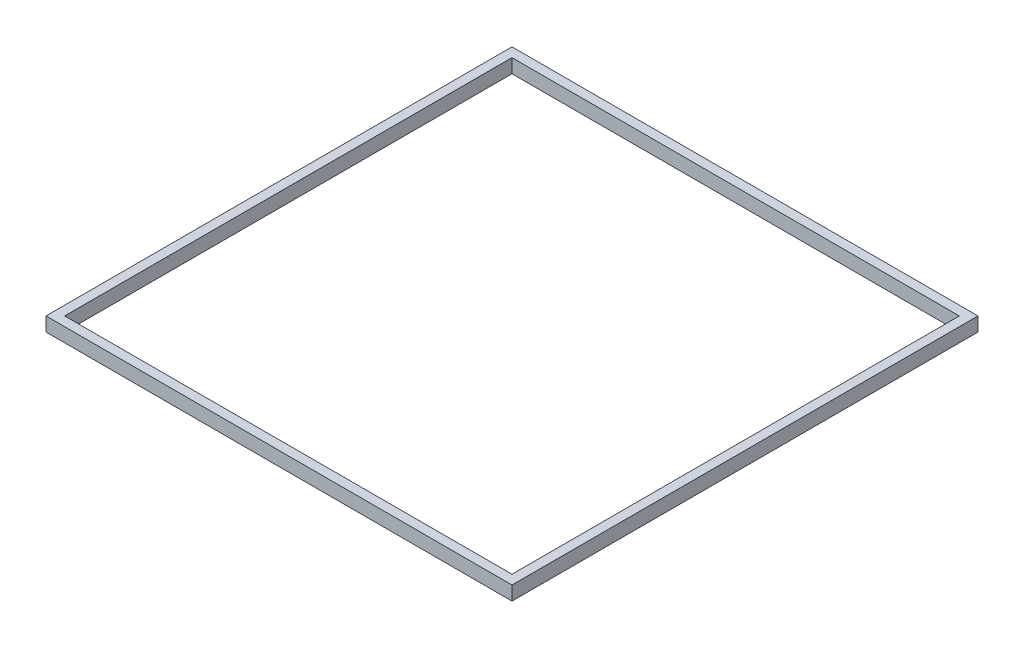
ISO-10303-21;
HEADER;
FILE_DESCRIPTION(('STEP AP214'),'2;1');
FILE_NAME('part.step','',(''),(''),'','','');
FILE_SCHEMA(('AUTOMOTIVE_DESIGN { 1 0 10303 214 1 1 1 1 }'));
ENDSEC;
DATA;
#1=APPLICATION_CONTEXT('core data for automotive mechanical design processes');
#2=APPLICATION_PROTOCOL_DEFINITION('international standard','automotive_design',2000,#1);
#3=PRODUCT_CONTEXT('',#1,'mechanical');
#4=PRODUCT('Part','Part','',(#3));
#5=PRODUCT_RELATED_PRODUCT_CATEGORY('part','',(#4));
#6=PRODUCT_DEFINITION_FORMATION('','',#4);
#7=PRODUCT_DEFINITION_CONTEXT('part definition',#1,'design');
#8=PRODUCT_DEFINITION('design','',#6,#7);
#9=PRODUCT_DEFINITION_SHAPE('','',#8);
#10=(LENGTH_UNIT() NAMED_UNIT(*) SI_UNIT(.MILLI.,.METRE.));
#11=(NAMED_UNIT(*) PLANE_ANGLE_UNIT() SI_UNIT($,.RADIAN.));
#12=(NAMED_UNIT(*) SI_UNIT($,.STERADIAN.) SOLID_ANGLE_UNIT());
#13=UNCERTAINTY_MEASURE_WITH_UNIT(LENGTH_MEASURE(1.E-05),#10,'distance_accuracy_value','');
#14=(GEOMETRIC_REPRESENTATION_CONTEXT(3) GLOBAL_UNCERTAINTY_ASSIGNED_CONTEXT((#13)) GLOBAL_UNIT_ASSIGNED_CONTEXT((#10,
#11,#12)) REPRESENTATION_CONTEXT('',''));
#15=CARTESIAN_POINT('',(0.,0.,0.));
#16=DIRECTION('',(0.,0.,1.));
#17=DIRECTION('',(1.,0.,0.));
#18=AXIS2_PLACEMENT_3D('',#15,#16,#17);
#19=CARTESIAN_POINT('',(0.,7.5,0.));
#20=DIRECTION('',(0.,-1.,0.));
#21=DIRECTION('',(0.,0.,-1.));
#22=AXIS2_PLACEMENT_3D('',#19,#20,#21);
#23=PLANE('',#22);
#24=DIRECTION('',(1.,0.,0.));
#25=VECTOR('',#24,1.);
#26=CARTESIAN_POINT('',(125.,7.5,125.));
#27=LINE('',#26,#25);
#28=CARTESIAN_POINT('',(-125.,7.5,125.));
#29=VERTEX_POINT('',#28);
#30=CARTESIAN_POINT('',(125.,7.5,125.));
#31=VERTEX_POINT('',#30);
#32=EDGE_CURVE('E143',#29,#31,#27,.T.);
#33=ORIENTED_EDGE('',*,*,#32,.T.);
#34=DIRECTION('',(0.,0.,-1.));
#35=VECTOR('',#34,1.);
#36=CARTESIAN_POINT('',(125.,7.5,125.));
#37=LINE('',#36,#35);
#38=CARTESIAN_POINT('',(125.,7.5,-125.));
#39=VERTEX_POINT('',#38);
#40=EDGE_CURVE('E146',#31,#39,#37,.T.);
#41=ORIENTED_EDGE('',*,*,#40,.T.);
#42=DIRECTION('',(-1.,0.,0.));
#43=VECTOR('',#42,1.);
#44=CARTESIAN_POINT('',(125.,7.5,-125.));
#45=LINE('',#44,#43);
#46=CARTESIAN_POINT('',(-125.,7.5,-125.));
#47=VERTEX_POINT('',#46);
#48=EDGE_CURVE('E149',#39,#47,#45,.T.);
#49=ORIENTED_EDGE('',*,*,#48,.T.);
#50=DIRECTION('',(0.,0.,1.));
#51=VECTOR('',#50,1.);
#52=CARTESIAN_POINT('',(-125.,7.5,125.));
#53=LINE('',#52,#51);
#54=EDGE_CURVE('E151',#47,#29,#53,.T.);
#55=ORIENTED_EDGE('',*,*,#54,.T.);
#56=EDGE_LOOP('',(#33,#41,#49,#55));
#57=FACE_BOUND('',#56,.T.);
#58=DIRECTION('',(0.,0.,1.));
#59=VECTOR('',#58,1.);
#60=CARTESIAN_POINT('',(-120.,7.5,120.));
#61=LINE('',#60,#59);
#62=CARTESIAN_POINT('',(-120.,7.5,-120.));
#63=VERTEX_POINT('',#62);
#64=CARTESIAN_POINT('',(-120.,7.5,120.));
#65=VERTEX_POINT('',#64);
#66=EDGE_CURVE('E107',#63,#65,#61,.T.);
#67=ORIENTED_EDGE('',*,*,#66,.F.);
#68=DIRECTION('',(-1.,0.,0.));
#69=VECTOR('',#68,1.);
#70=CARTESIAN_POINT('',(120.,7.5,-120.));
#71=LINE('',#70,#69);
#72=CARTESIAN_POINT('',(120.,7.5,-120.));
#73=VERTEX_POINT('',#72);
#74=EDGE_CURVE('E129',#73,#63,#71,.T.);
#75=ORIENTED_EDGE('',*,*,#74,.F.);
#76=DIRECTION('',(0.,0.,-1.));
#77=VECTOR('',#76,1.);
#78=CARTESIAN_POINT('',(120.,7.5,120.));
#79=LINE('',#78,#77);
#80=CARTESIAN_POINT('',(120.,7.5,120.));
#81=VERTEX_POINT('',#80);
#82=EDGE_CURVE('E127',#81,#73,#79,.T.);
#83=ORIENTED_EDGE('',*,*,#82,.F.);
#84=DIRECTION('',(1.,0.,0.));
#85=VECTOR('',#84,1.);
#86=CARTESIAN_POINT('',(120.,7.5,120.));
#87=LINE('',#86,#85);
#88=EDGE_CURVE('E115',#65,#81,#87,.T.);
#89=ORIENTED_EDGE('',*,*,#88,.F.);
#90=EDGE_LOOP('',(#67,#75,#83,#89));
#91=FACE_BOUND('',#90,.T.);
#92=ADVANCED_FACE('F42',(#57,#91),#23,.F.);
#93=CARTESIAN_POINT('',(0.,0.,0.));
#94=DIRECTION('',(0.,-1.,0.));
#95=DIRECTION('',(0.,0.,-1.));
#96=AXIS2_PLACEMENT_3D('',#93,#94,#95);
#97=PLANE('',#96);
#98=DIRECTION('',(1.,0.,0.));
#99=VECTOR('',#98,1.);
#100=CARTESIAN_POINT('',(125.,0.,125.));
#101=LINE('',#100,#99);
#102=CARTESIAN_POINT('',(-125.,0.,125.));
#103=VERTEX_POINT('',#102);
#104=CARTESIAN_POINT('',(125.,0.,125.));
#105=VERTEX_POINT('',#104);
#106=EDGE_CURVE('E123',#103,#105,#101,.T.);
#107=ORIENTED_EDGE('',*,*,#106,.F.);
#108=DIRECTION('',(0.,0.,1.));
#109=VECTOR('',#108,1.);
#110=CARTESIAN_POINT('',(-125.,0.,125.));
#111=LINE('',#110,#109);
#112=CARTESIAN_POINT('',(-125.,0.,-125.));
#113=VERTEX_POINT('',#112);
#114=EDGE_CURVE('E147',#113,#103,#111,.T.);
#115=ORIENTED_EDGE('',*,*,#114,.F.);
#116=DIRECTION('',(-1.,0.,0.));
#117=VECTOR('',#116,1.);
#118=CARTESIAN_POINT('',(125.,0.,-125.));
#119=LINE('',#118,#117);
#120=CARTESIAN_POINT('',(125.,0.,-125.));
#121=VERTEX_POINT('',#120);
#122=EDGE_CURVE('E158',#121,#113,#119,.T.);
#123=ORIENTED_EDGE('',*,*,#122,.F.);
#124=DIRECTION('',(0.,0.,-1.));
#125=VECTOR('',#124,1.);
#126=CARTESIAN_POINT('',(125.,0.,125.));
#127=LINE('',#126,#125);
#128=EDGE_CURVE('E156',#105,#121,#127,.T.);
#129=ORIENTED_EDGE('',*,*,#128,.F.);
#130=EDGE_LOOP('',(#107,#115,#123,#129));
#131=FACE_BOUND('',#130,.T.);
#132=DIRECTION('',(-1.,0.,0.));
#133=VECTOR('',#132,1.);
#134=CARTESIAN_POINT('',(120.,0.,-120.));
#135=LINE('',#134,#133);
#136=CARTESIAN_POINT('',(120.,0.,-120.));
#137=VERTEX_POINT('',#136);
#138=CARTESIAN_POINT('',(-120.,0.,-120.));
#139=VERTEX_POINT('',#138);
#140=EDGE_CURVE('E116',#137,#139,#135,.T.);
#141=ORIENTED_EDGE('',*,*,#140,.T.);
#142=DIRECTION('',(0.,0.,1.));
#143=VECTOR('',#142,1.);
#144=CARTESIAN_POINT('',(-120.,0.,120.));
#145=LINE('',#144,#143);
#146=CARTESIAN_POINT('',(-120.,0.,120.));
#147=VERTEX_POINT('',#146);
#148=EDGE_CURVE('E65',#139,#147,#145,.T.);
#149=ORIENTED_EDGE('',*,*,#148,.T.);
#150=DIRECTION('',(1.,0.,0.));
#151=VECTOR('',#150,1.);
#152=CARTESIAN_POINT('',(120.,0.,120.));
#153=LINE('',#152,#151);
#154=CARTESIAN_POINT('',(120.,0.,120.));
#155=VERTEX_POINT('',#154);
#156=EDGE_CURVE('E122',#147,#155,#153,.T.);
#157=ORIENTED_EDGE('',*,*,#156,.T.);
#158=DIRECTION('',(0.,0.,-1.));
#159=VECTOR('',#158,1.);
#160=CARTESIAN_POINT('',(120.,0.,120.));
#161=LINE('',#160,#159);
#162=EDGE_CURVE('E135',#155,#137,#161,.T.);
#163=ORIENTED_EDGE('',*,*,#162,.T.);
#164=EDGE_LOOP('',(#141,#149,#157,#163));
#165=FACE_BOUND('',#164,.T.);
#166=ADVANCED_FACE('F176',(#131,#165),#97,.T.);
#167=CARTESIAN_POINT('',(125.,7.5,125.));
#168=DIRECTION('',(0.,0.,-1.));
#169=DIRECTION('',(-1.,0.,0.));
#170=AXIS2_PLACEMENT_3D('',#167,#168,#169);
#171=PLANE('',#170);
#172=ORIENTED_EDGE('',*,*,#106,.T.);
#173=DIRECTION('',(0.,-1.,0.));
#174=VECTOR('',#173,1.);
#175=CARTESIAN_POINT('',(125.,7.5,125.));
#176=LINE('',#175,#174);
#177=EDGE_CURVE('E11',#31,#105,#176,.T.);
#178=ORIENTED_EDGE('',*,*,#177,.F.);
#179=ORIENTED_EDGE('',*,*,#32,.F.);
#180=DIRECTION('',(0.,-1.,0.));
#181=VECTOR('',#180,1.);
#182=CARTESIAN_POINT('',(-125.,7.5,125.));
#183=LINE('',#182,#181);
#184=EDGE_CURVE('E153',#29,#103,#183,.T.);
#185=ORIENTED_EDGE('',*,*,#184,.T.);
#186=EDGE_LOOP('',(#172,#178,#179,#185));
#187=FACE_BOUND('',#186,.T.);
#188=ADVANCED_FACE('F44',(#187),#171,.F.);
#189=CARTESIAN_POINT('',(125.,7.5,125.));
#190=DIRECTION('',(-1.,0.,0.));
#191=DIRECTION('',(0.,0.,1.));
#192=AXIS2_PLACEMENT_3D('',#189,#190,#191);
#193=PLANE('',#192);
#194=ORIENTED_EDGE('',*,*,#128,.T.);
#195=DIRECTION('',(0.,-1.,0.));
#196=VECTOR('',#195,1.);
#197=CARTESIAN_POINT('',(125.,7.5,-125.));
#198=LINE('',#197,#196);
#199=EDGE_CURVE('E50',#39,#121,#198,.T.);
#200=ORIENTED_EDGE('',*,*,#199,.F.);
#201=ORIENTED_EDGE('',*,*,#40,.F.);
#202=ORIENTED_EDGE('',*,*,#177,.T.);
#203=EDGE_LOOP('',(#194,#200,#201,#202));
#204=FACE_BOUND('',#203,.T.);
#205=ADVANCED_FACE('F186',(#204),#193,.F.);
#206=CARTESIAN_POINT('',(125.,7.5,-125.));
#207=DIRECTION('',(0.,0.,1.));
#208=DIRECTION('',(1.,0.,0.));
#209=AXIS2_PLACEMENT_3D('',#206,#207,#208);
#210=PLANE('',#209);
#211=ORIENTED_EDGE('',*,*,#122,.T.);
#212=DIRECTION('',(0.,-1.,0.));
#213=VECTOR('',#212,1.);
#214=CARTESIAN_POINT('',(-125.,7.5,-125.));
#215=LINE('',#214,#213);
#216=EDGE_CURVE('E163',#47,#113,#215,.T.);
#217=ORIENTED_EDGE('',*,*,#216,.F.);
#218=ORIENTED_EDGE('',*,*,#48,.F.);
#219=ORIENTED_EDGE('',*,*,#199,.T.);
#220=EDGE_LOOP('',(#211,#217,#218,#219));
#221=FACE_BOUND('',#220,.T.);
#222=ADVANCED_FACE('F170',(#221),#210,.F.);
#223=CARTESIAN_POINT('',(-125.,7.5,125.));
#224=DIRECTION('',(1.,0.,0.));
#225=DIRECTION('',(0.,0.,-1.));
#226=AXIS2_PLACEMENT_3D('',#223,#224,#225);
#227=PLANE('',#226);
#228=ORIENTED_EDGE('',*,*,#114,.T.);
#229=ORIENTED_EDGE('',*,*,#184,.F.);
#230=ORIENTED_EDGE('',*,*,#54,.F.);
#231=ORIENTED_EDGE('',*,*,#216,.T.);
#232=EDGE_LOOP('',(#228,#229,#230,#231));
#233=FACE_BOUND('',#232,.T.);
#234=ADVANCED_FACE('F180',(#233),#227,.F.);
#235=CARTESIAN_POINT('',(-120.,7.5,120.));
#236=DIRECTION('',(1.,0.,0.));
#237=DIRECTION('',(0.,0.,-1.));
#238=AXIS2_PLACEMENT_3D('',#235,#236,#237);
#239=PLANE('',#238);
#240=ORIENTED_EDGE('',*,*,#148,.F.);
#241=DIRECTION('',(0.,-1.,0.));
#242=VECTOR('',#241,1.);
#243=CARTESIAN_POINT('',(-120.,7.5,-120.));
#244=LINE('',#243,#242);
#245=EDGE_CURVE('E111',#63,#139,#244,.T.);
#246=ORIENTED_EDGE('',*,*,#245,.F.);
#247=ORIENTED_EDGE('',*,*,#66,.T.);
#248=DIRECTION('',(0.,-1.,0.));
#249=VECTOR('',#248,1.);
#250=CARTESIAN_POINT('',(-120.,7.5,120.));
#251=LINE('',#250,#249);
#252=EDGE_CURVE('E110',#65,#147,#251,.T.);
#253=ORIENTED_EDGE('',*,*,#252,.T.);
#254=EDGE_LOOP('',(#240,#246,#247,#253));
#255=FACE_BOUND('',#254,.T.);
#256=ADVANCED_FACE('F109',(#255),#239,.T.);
#257=CARTESIAN_POINT('',(120.,7.5,120.));
#258=DIRECTION('',(0.,0.,-1.));
#259=DIRECTION('',(-1.,0.,0.));
#260=AXIS2_PLACEMENT_3D('',#257,#258,#259);
#261=PLANE('',#260);
#262=ORIENTED_EDGE('',*,*,#156,.F.);
#263=ORIENTED_EDGE('',*,*,#252,.F.);
#264=ORIENTED_EDGE('',*,*,#88,.T.);
#265=DIRECTION('',(0.,-1.,0.));
#266=VECTOR('',#265,1.);
#267=CARTESIAN_POINT('',(120.,7.5,120.));
#268=LINE('',#267,#266);
#269=EDGE_CURVE('E124',#81,#155,#268,.T.);
#270=ORIENTED_EDGE('',*,*,#269,.T.);
#271=EDGE_LOOP('',(#262,#263,#264,#270));
#272=FACE_BOUND('',#271,.T.);
#273=ADVANCED_FACE('F119',(#272),#261,.T.);
#274=CARTESIAN_POINT('',(120.,7.5,120.));
#275=DIRECTION('',(-1.,0.,0.));
#276=DIRECTION('',(0.,0.,1.));
#277=AXIS2_PLACEMENT_3D('',#274,#275,#276);
#278=PLANE('',#277);
#279=ORIENTED_EDGE('',*,*,#162,.F.);
#280=ORIENTED_EDGE('',*,*,#269,.F.);
#281=ORIENTED_EDGE('',*,*,#82,.T.);
#282=DIRECTION('',(0.,-1.,0.));
#283=VECTOR('',#282,1.);
#284=CARTESIAN_POINT('',(120.,7.5,-120.));
#285=LINE('',#284,#283);
#286=EDGE_CURVE('E57',#73,#137,#285,.T.);
#287=ORIENTED_EDGE('',*,*,#286,.T.);
#288=EDGE_LOOP('',(#279,#280,#281,#287));
#289=FACE_BOUND('',#288,.T.);
#290=ADVANCED_FACE('F209',(#289),#278,.T.);
#291=CARTESIAN_POINT('',(120.,7.5,-120.));
#292=DIRECTION('',(0.,0.,1.));
#293=DIRECTION('',(1.,0.,0.));
#294=AXIS2_PLACEMENT_3D('',#291,#292,#293);
#295=PLANE('',#294);
#296=ORIENTED_EDGE('',*,*,#140,.F.);
#297=ORIENTED_EDGE('',*,*,#286,.F.);
#298=ORIENTED_EDGE('',*,*,#74,.T.);
#299=ORIENTED_EDGE('',*,*,#245,.T.);
#300=EDGE_LOOP('',(#296,#297,#298,#299));
#301=FACE_BOUND('',#300,.T.);
#302=ADVANCED_FACE('F213',(#301),#295,.T.);
#303=CLOSED_SHELL('',(#92,#166,#188,#205,#222,#234,#256,#273,#290,#302));
#304=MANIFOLD_SOLID_BREP('B2',#303);
#305=ADVANCED_BREP_SHAPE_REPRESENTATION('',(#18,#304),#14);
#306=SHAPE_DEFINITION_REPRESENTATION(#9,#305);
ENDSEC;
END-ISO-10303-21;
